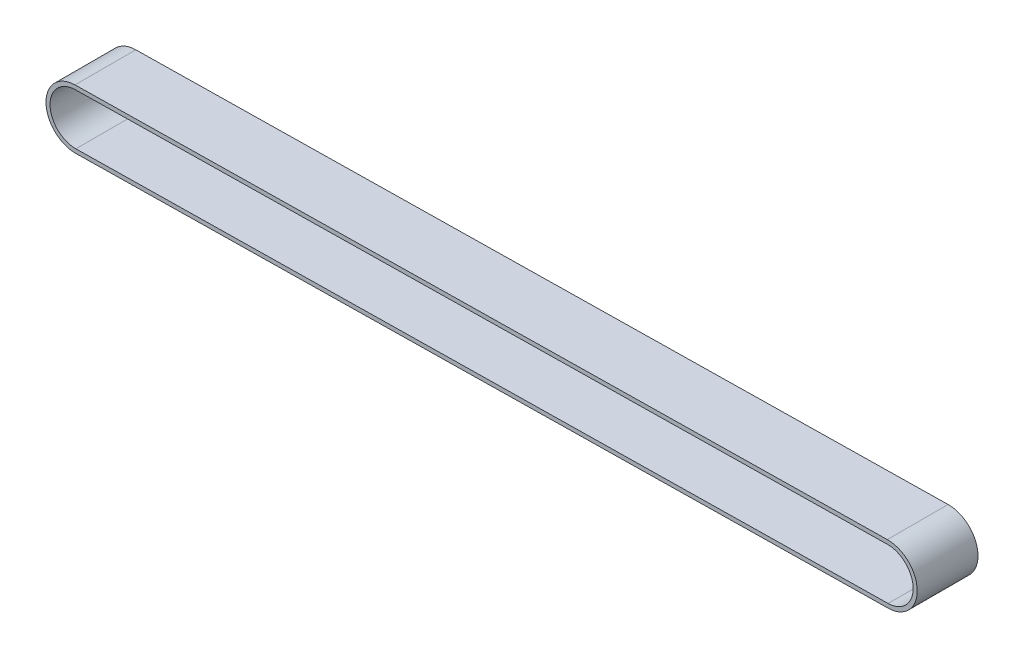
ISO-10303-21;
HEADER;
FILE_DESCRIPTION(('STEP AP214'),'2;1');
FILE_NAME('part.step','',(''),(''),'','','');
FILE_SCHEMA(('AUTOMOTIVE_DESIGN { 1 0 10303 214 1 1 1 1 }'));
ENDSEC;
DATA;
#1=APPLICATION_CONTEXT('core data for automotive mechanical design processes');
#2=APPLICATION_PROTOCOL_DEFINITION('international standard','automotive_design',2000,#1);
#3=PRODUCT_CONTEXT('',#1,'mechanical');
#4=PRODUCT('Part','Part','',(#3));
#5=PRODUCT_RELATED_PRODUCT_CATEGORY('part','',(#4));
#6=PRODUCT_DEFINITION_FORMATION('','',#4);
#7=PRODUCT_DEFINITION_CONTEXT('part definition',#1,'design');
#8=PRODUCT_DEFINITION('design','',#6,#7);
#9=PRODUCT_DEFINITION_SHAPE('','',#8);
#10=(LENGTH_UNIT() NAMED_UNIT(*) SI_UNIT(.MILLI.,.METRE.));
#11=(NAMED_UNIT(*) PLANE_ANGLE_UNIT() SI_UNIT($,.RADIAN.));
#12=(NAMED_UNIT(*) SI_UNIT($,.STERADIAN.) SOLID_ANGLE_UNIT());
#13=UNCERTAINTY_MEASURE_WITH_UNIT(LENGTH_MEASURE(1.E-05),#10,'distance_accuracy_value','');
#14=(GEOMETRIC_REPRESENTATION_CONTEXT(3) GLOBAL_UNCERTAINTY_ASSIGNED_CONTEXT((#13)) GLOBAL_UNIT_ASSIGNED_CONTEXT((#10,
#11,#12)) REPRESENTATION_CONTEXT('',''));
#15=CARTESIAN_POINT('',(0.,0.,0.));
#16=DIRECTION('',(0.,0.,1.));
#17=DIRECTION('',(1.,0.,0.));
#18=AXIS2_PLACEMENT_3D('',#15,#16,#17);
#19=CARTESIAN_POINT('',(-1.1296519275561E-11,-4.88498130835069E-12,7.5));
#20=DIRECTION('',(0.,0.,-1.));
#21=DIRECTION('',(-1.,0.,0.));
#22=AXIS2_PLACEMENT_3D('',#19,#20,#21);
#23=CYLINDRICAL_SURFACE('',#22,7.28);
#24=CARTESIAN_POINT('',(-1.1296519275561E-11,-4.88498130835069E-12,-7.5));
#25=DIRECTION('',(0.,0.,-1.));
#26=DIRECTION('',(-1.,0.,0.));
#27=AXIS2_PLACEMENT_3D('',#24,#25,#26);
#28=CIRCLE('',#27,7.28);
#29=CARTESIAN_POINT('',(0.110751633321415,-7.27915751140098,-7.5));
#30=VERTEX_POINT('',#29);
#31=CARTESIAN_POINT('',(-0.110751633344072,7.27915751139121,-7.5));
#32=VERTEX_POINT('',#31);
#33=EDGE_CURVE('E178',#30,#32,#28,.T.);
#34=ORIENTED_EDGE('',*,*,#33,.F.);
#35=DIRECTION('',(0.,0.,-1.));
#36=VECTOR('',#35,1.);
#37=CARTESIAN_POINT('',(0.110751633321415,-7.27915751140098,7.5));
#38=LINE('',#37,#36);
#39=CARTESIAN_POINT('',(0.110751633321415,-7.27915751140098,7.5));
#40=VERTEX_POINT('',#39);
#41=EDGE_CURVE('E12',#40,#30,#38,.T.);
#42=ORIENTED_EDGE('',*,*,#41,.F.);
#43=CARTESIAN_POINT('',(-1.1296519275561E-11,-4.88498130835069E-12,7.5));
#44=DIRECTION('',(0.,0.,-1.));
#45=DIRECTION('',(-1.,0.,0.));
#46=AXIS2_PLACEMENT_3D('',#43,#44,#45);
#47=CIRCLE('',#46,7.28);
#48=CARTESIAN_POINT('',(-0.110751633344072,7.27915751139121,7.5));
#49=VERTEX_POINT('',#48);
#50=EDGE_CURVE('E184',#40,#49,#47,.T.);
#51=ORIENTED_EDGE('',*,*,#50,.T.);
#52=DIRECTION('',(0.,0.,-1.));
#53=VECTOR('',#52,1.);
#54=CARTESIAN_POINT('',(-0.110751633344072,7.27915751139121,7.5));
#55=LINE('',#54,#53);
#56=EDGE_CURVE('E72',#49,#32,#55,.T.);
#57=ORIENTED_EDGE('',*,*,#56,.T.);
#58=EDGE_LOOP('',(#34,#42,#51,#57));
#59=FACE_BOUND('',#58,.T.);
#60=ADVANCED_FACE('F69',(#59),#23,.T.);
#61=CARTESIAN_POINT('',(0.110751633321479,-7.27915751140098,7.5));
#62=DIRECTION('',(0.0152131364468099,-0.999884273543419,0.));
#63=DIRECTION('',(0.999884273543419,0.0152131364468099,0.));
#64=AXIS2_PLACEMENT_3D('',#61,#62,#63);
#65=PLANE('',#64);
#66=DIRECTION('',(-0.999884273543419,-0.0152131364468099,0.));
#67=VECTOR('',#66,1.);
#68=CARTESIAN_POINT('',(0.110751633321479,-7.27915751140098,-7.5));
#69=LINE('',#68,#67);
#70=CARTESIAN_POINT('',(200.572178165941,-4.22915751154553,-7.5));
#71=VERTEX_POINT('',#70);
#72=EDGE_CURVE('E189',#71,#30,#69,.T.);
#73=ORIENTED_EDGE('',*,*,#72,.F.);
#74=DIRECTION('',(0.,0.,-1.));
#75=VECTOR('',#74,1.);
#76=CARTESIAN_POINT('',(200.572178165941,-4.22915751154553,7.5));
#77=LINE('',#76,#75);
#78=CARTESIAN_POINT('',(200.572178165941,-4.22915751154553,7.5));
#79=VERTEX_POINT('',#78);
#80=EDGE_CURVE('E78',#79,#71,#77,.T.);
#81=ORIENTED_EDGE('',*,*,#80,.F.);
#82=DIRECTION('',(-0.999884273543419,-0.0152131364468099,0.));
#83=VECTOR('',#82,1.);
#84=CARTESIAN_POINT('',(0.110751633321479,-7.27915751140098,7.5));
#85=LINE('',#84,#83);
#86=EDGE_CURVE('E197',#79,#40,#85,.T.);
#87=ORIENTED_EDGE('',*,*,#86,.T.);
#88=ORIENTED_EDGE('',*,*,#41,.T.);
#89=EDGE_LOOP('',(#73,#81,#87,#88));
#90=FACE_BOUND('',#89,.T.);
#91=ADVANCED_FACE('F231',(#90),#65,.T.);
#92=CARTESIAN_POINT('',(200.461426532608,3.04999999985056,7.5));
#93=DIRECTION('',(0.,0.,-1.));
#94=DIRECTION('',(-1.,0.,0.));
#95=AXIS2_PLACEMENT_3D('',#92,#93,#94);
#96=CYLINDRICAL_SURFACE('',#95,7.28);
#97=CARTESIAN_POINT('',(200.461426532608,3.04999999985056,-7.5));
#98=DIRECTION('',(0.,0.,-1.));
#99=DIRECTION('',(-1.,0.,0.));
#100=AXIS2_PLACEMENT_3D('',#97,#98,#99);
#101=CIRCLE('',#100,7.28);
#102=CARTESIAN_POINT('',(200.350674899275,10.3291575112467,-7.5));
#103=VERTEX_POINT('',#102);
#104=EDGE_CURVE('E208',#103,#71,#101,.T.);
#105=ORIENTED_EDGE('',*,*,#104,.F.);
#106=DIRECTION('',(0.,0.,-1.));
#107=VECTOR('',#106,1.);
#108=CARTESIAN_POINT('',(200.350674899275,10.3291575112467,7.5));
#109=LINE('',#108,#107);
#110=CARTESIAN_POINT('',(200.350674899275,10.3291575112467,7.5));
#111=VERTEX_POINT('',#110);
#112=EDGE_CURVE('E216',#111,#103,#109,.T.);
#113=ORIENTED_EDGE('',*,*,#112,.F.);
#114=CARTESIAN_POINT('',(200.461426532608,3.04999999985056,7.5));
#115=DIRECTION('',(0.,0.,-1.));
#116=DIRECTION('',(-1.,0.,0.));
#117=AXIS2_PLACEMENT_3D('',#114,#115,#116);
#118=CIRCLE('',#117,7.28);
#119=EDGE_CURVE('E193',#111,#79,#118,.T.);
#120=ORIENTED_EDGE('',*,*,#119,.T.);
#121=ORIENTED_EDGE('',*,*,#80,.T.);
#122=EDGE_LOOP('',(#105,#113,#120,#121));
#123=FACE_BOUND('',#122,.T.);
#124=ADVANCED_FACE('F235',(#123),#96,.T.);
#125=CARTESIAN_POINT('',(-0.110751633344072,7.27915751139121,7.5));
#126=DIRECTION('',(-0.0152131364468099,0.999884273543419,0.));
#127=DIRECTION('',(-0.999884273543419,-0.0152131364468099,0.));
#128=AXIS2_PLACEMENT_3D('',#125,#126,#127);
#129=PLANE('',#128);
#130=DIRECTION('',(0.999884273543419,0.0152131364468099,0.));
#131=VECTOR('',#130,1.);
#132=CARTESIAN_POINT('',(-0.110751633344072,7.27915751139121,-7.5));
#133=LINE('',#132,#131);
#134=EDGE_CURVE('E204',#32,#103,#133,.T.);
#135=ORIENTED_EDGE('',*,*,#134,.F.);
#136=ORIENTED_EDGE('',*,*,#56,.F.);
#137=DIRECTION('',(0.999884273543419,0.0152131364468099,0.));
#138=VECTOR('',#137,1.);
#139=CARTESIAN_POINT('',(-0.110751633344072,7.27915751139121,7.5));
#140=LINE('',#139,#138);
#141=EDGE_CURVE('E188',#49,#111,#140,.T.);
#142=ORIENTED_EDGE('',*,*,#141,.T.);
#143=ORIENTED_EDGE('',*,*,#112,.T.);
#144=EDGE_LOOP('',(#135,#136,#142,#143));
#145=FACE_BOUND('',#144,.T.);
#146=ADVANCED_FACE('F226',(#145),#129,.T.);
#147=CARTESIAN_POINT('',(-1.1296519275561E-11,-4.88498130835069E-12,7.5));
#148=DIRECTION('',(0.,0.,-1.));
#149=DIRECTION('',(-1.,0.,0.));
#150=AXIS2_PLACEMENT_3D('',#147,#148,#149);
#151=PLANE('',#150);
#152=DIRECTION('',(-0.999884273543419,-0.0152131364468099,0.));
#153=VECTOR('',#152,1.);
#154=CARTESIAN_POINT('',(0.0955384968746694,-6.27927323785756,7.5));
#155=LINE('',#154,#153);
#156=CARTESIAN_POINT('',(200.556965029494,-3.22927323800211,7.5));
#157=VERTEX_POINT('',#156);
#158=CARTESIAN_POINT('',(0.0955384968746031,-6.27927323785756,7.5));
#159=VERTEX_POINT('',#158);
#160=EDGE_CURVE('E144',#157,#159,#155,.T.);
#161=ORIENTED_EDGE('',*,*,#160,.T.);
#162=CARTESIAN_POINT('',(-1.1296519275561E-11,-4.88498130835069E-12,7.5));
#163=DIRECTION('',(0.,0.,-1.));
#164=DIRECTION('',(-1.,0.,0.));
#165=AXIS2_PLACEMENT_3D('',#162,#163,#164);
#166=CIRCLE('',#165,6.28);
#167=CARTESIAN_POINT('',(-0.0955384968972624,6.27927323784779,7.5));
#168=VERTEX_POINT('',#167);
#169=EDGE_CURVE('E137',#159,#168,#166,.T.);
#170=ORIENTED_EDGE('',*,*,#169,.T.);
#171=DIRECTION('',(0.999884273543419,0.0152131364468099,0.));
#172=VECTOR('',#171,1.);
#173=CARTESIAN_POINT('',(-0.0955384968972625,6.27927323784779,7.5));
#174=LINE('',#173,#172);
#175=CARTESIAN_POINT('',(200.365888035722,9.32927323770324,7.5));
#176=VERTEX_POINT('',#175);
#177=EDGE_CURVE('E147',#168,#176,#174,.T.);
#178=ORIENTED_EDGE('',*,*,#177,.T.);
#179=CARTESIAN_POINT('',(200.461426532608,3.04999999985056,7.5));
#180=DIRECTION('',(0.,0.,-1.));
#181=DIRECTION('',(-1.,0.,0.));
#182=AXIS2_PLACEMENT_3D('',#179,#180,#181);
#183=CIRCLE('',#182,6.28);
#184=EDGE_CURVE('E86',#176,#157,#183,.T.);
#185=ORIENTED_EDGE('',*,*,#184,.T.);
#186=EDGE_LOOP('',(#161,#170,#178,#185));
#187=FACE_BOUND('',#186,.T.);
#188=ORIENTED_EDGE('',*,*,#50,.F.);
#189=ORIENTED_EDGE('',*,*,#86,.F.);
#190=ORIENTED_EDGE('',*,*,#119,.F.);
#191=ORIENTED_EDGE('',*,*,#141,.F.);
#192=EDGE_LOOP('',(#188,#189,#190,#191));
#193=FACE_BOUND('',#192,.T.);
#194=ADVANCED_FACE('F152',(#187,#193),#151,.F.);
#195=CARTESIAN_POINT('',(-1.1296519275561E-11,-4.88498130835069E-12,-7.5));
#196=DIRECTION('',(0.,0.,-1.));
#197=DIRECTION('',(-1.,0.,0.));
#198=AXIS2_PLACEMENT_3D('',#195,#196,#197);
#199=PLANE('',#198);
#200=CARTESIAN_POINT('',(-1.1296519275561E-11,-4.88498130835069E-12,-7.5));
#201=DIRECTION('',(0.,0.,-1.));
#202=DIRECTION('',(-1.,0.,0.));
#203=AXIS2_PLACEMENT_3D('',#200,#201,#202);
#204=CIRCLE('',#203,6.28);
#205=CARTESIAN_POINT('',(0.0955384968746031,-6.27927323785756,-7.5));
#206=VERTEX_POINT('',#205);
#207=CARTESIAN_POINT('',(-0.0955384968972624,6.27927323784779,-7.5));
#208=VERTEX_POINT('',#207);
#209=EDGE_CURVE('E94',#206,#208,#204,.T.);
#210=ORIENTED_EDGE('',*,*,#209,.F.);
#211=DIRECTION('',(-0.999884273543419,-0.0152131364468099,0.));
#212=VECTOR('',#211,1.);
#213=CARTESIAN_POINT('',(0.0955384968746694,-6.27927323785756,-7.5));
#214=LINE('',#213,#212);
#215=CARTESIAN_POINT('',(200.556965029494,-3.22927323800211,-7.5));
#216=VERTEX_POINT('',#215);
#217=EDGE_CURVE('E156',#216,#206,#214,.T.);
#218=ORIENTED_EDGE('',*,*,#217,.F.);
#219=CARTESIAN_POINT('',(200.461426532608,3.04999999985056,-7.5));
#220=DIRECTION('',(0.,0.,-1.));
#221=DIRECTION('',(-1.,0.,0.));
#222=AXIS2_PLACEMENT_3D('',#219,#220,#221);
#223=CIRCLE('',#222,6.28);
#224=CARTESIAN_POINT('',(200.365888035722,9.32927323770324,-7.5));
#225=VERTEX_POINT('',#224);
#226=EDGE_CURVE('E160',#225,#216,#223,.T.);
#227=ORIENTED_EDGE('',*,*,#226,.F.);
#228=DIRECTION('',(0.999884273543419,0.0152131364468099,0.));
#229=VECTOR('',#228,1.);
#230=CARTESIAN_POINT('',(-0.0955384968972625,6.27927323784779,-7.5));
#231=LINE('',#230,#229);
#232=EDGE_CURVE('E169',#208,#225,#231,.T.);
#233=ORIENTED_EDGE('',*,*,#232,.F.);
#234=EDGE_LOOP('',(#210,#218,#227,#233));
#235=FACE_BOUND('',#234,.T.);
#236=ORIENTED_EDGE('',*,*,#33,.T.);
#237=ORIENTED_EDGE('',*,*,#134,.T.);
#238=ORIENTED_EDGE('',*,*,#104,.T.);
#239=ORIENTED_EDGE('',*,*,#72,.T.);
#240=EDGE_LOOP('',(#236,#237,#238,#239));
#241=FACE_BOUND('',#240,.T.);
#242=ADVANCED_FACE('F228',(#235,#241),#199,.T.);
#243=CARTESIAN_POINT('',(-1.1296519275561E-11,-4.88498130835069E-12,7.5));
#244=DIRECTION('',(0.,0.,-1.));
#245=DIRECTION('',(-1.,0.,0.));
#246=AXIS2_PLACEMENT_3D('',#243,#244,#245);
#247=CYLINDRICAL_SURFACE('',#246,6.28);
#248=ORIENTED_EDGE('',*,*,#209,.T.);
#249=DIRECTION('',(0.,0.,-1.));
#250=VECTOR('',#249,1.);
#251=CARTESIAN_POINT('',(-0.0955384968972624,6.27927323784779,7.5));
#252=LINE('',#251,#250);
#253=EDGE_CURVE('E133',#168,#208,#252,.T.);
#254=ORIENTED_EDGE('',*,*,#253,.F.);
#255=ORIENTED_EDGE('',*,*,#169,.F.);
#256=DIRECTION('',(0.,0.,-1.));
#257=VECTOR('',#256,1.);
#258=CARTESIAN_POINT('',(0.0955384968746031,-6.27927323785756,7.5));
#259=LINE('',#258,#257);
#260=EDGE_CURVE('E175',#159,#206,#259,.T.);
#261=ORIENTED_EDGE('',*,*,#260,.T.);
#262=EDGE_LOOP('',(#248,#254,#255,#261));
#263=FACE_BOUND('',#262,.T.);
#264=ADVANCED_FACE('F135',(#263),#247,.F.);
#265=CARTESIAN_POINT('',(0.0955384968746694,-6.27927323785756,7.5));
#266=DIRECTION('',(0.0152131364468099,-0.999884273543419,0.));
#267=DIRECTION('',(0.999884273543419,0.0152131364468099,0.));
#268=AXIS2_PLACEMENT_3D('',#265,#266,#267);
#269=PLANE('',#268);
#270=ORIENTED_EDGE('',*,*,#217,.T.);
#271=ORIENTED_EDGE('',*,*,#260,.F.);
#272=ORIENTED_EDGE('',*,*,#160,.F.);
#273=DIRECTION('',(0.,0.,-1.));
#274=VECTOR('',#273,1.);
#275=CARTESIAN_POINT('',(200.556965029494,-3.22927323800211,7.5));
#276=LINE('',#275,#274);
#277=EDGE_CURVE('E179',#157,#216,#276,.T.);
#278=ORIENTED_EDGE('',*,*,#277,.T.);
#279=EDGE_LOOP('',(#270,#271,#272,#278));
#280=FACE_BOUND('',#279,.T.);
#281=ADVANCED_FACE('F273',(#280),#269,.F.);
#282=CARTESIAN_POINT('',(200.461426532608,3.04999999985056,7.5));
#283=DIRECTION('',(0.,0.,-1.));
#284=DIRECTION('',(-1.,0.,0.));
#285=AXIS2_PLACEMENT_3D('',#282,#283,#284);
#286=CYLINDRICAL_SURFACE('',#285,6.28);
#287=ORIENTED_EDGE('',*,*,#226,.T.);
#288=ORIENTED_EDGE('',*,*,#277,.F.);
#289=ORIENTED_EDGE('',*,*,#184,.F.);
#290=DIRECTION('',(0.,0.,-1.));
#291=VECTOR('',#290,1.);
#292=CARTESIAN_POINT('',(200.365888035722,9.32927323770324,7.5));
#293=LINE('',#292,#291);
#294=EDGE_CURVE('E143',#176,#225,#293,.T.);
#295=ORIENTED_EDGE('',*,*,#294,.T.);
#296=EDGE_LOOP('',(#287,#288,#289,#295));
#297=FACE_BOUND('',#296,.T.);
#298=ADVANCED_FACE('F266',(#297),#286,.F.);
#299=CARTESIAN_POINT('',(-0.0955384968972625,6.27927323784779,7.5));
#300=DIRECTION('',(-0.0152131364468099,0.999884273543419,0.));
#301=DIRECTION('',(-0.999884273543419,-0.0152131364468099,0.));
#302=AXIS2_PLACEMENT_3D('',#299,#300,#301);
#303=PLANE('',#302);
#304=ORIENTED_EDGE('',*,*,#232,.T.);
#305=ORIENTED_EDGE('',*,*,#294,.F.);
#306=ORIENTED_EDGE('',*,*,#177,.F.);
#307=ORIENTED_EDGE('',*,*,#253,.T.);
#308=EDGE_LOOP('',(#304,#305,#306,#307));
#309=FACE_BOUND('',#308,.T.);
#310=ADVANCED_FACE('F148',(#309),#303,.F.);
#311=CLOSED_SHELL('',(#60,#91,#124,#146,#194,#242,#264,#281,#298,#310));
#312=MANIFOLD_SOLID_BREP('B2',#311);
#313=ADVANCED_BREP_SHAPE_REPRESENTATION('',(#18,#312),#14);
#314=SHAPE_DEFINITION_REPRESENTATION(#9,#313);
ENDSEC;
END-ISO-10303-21;
